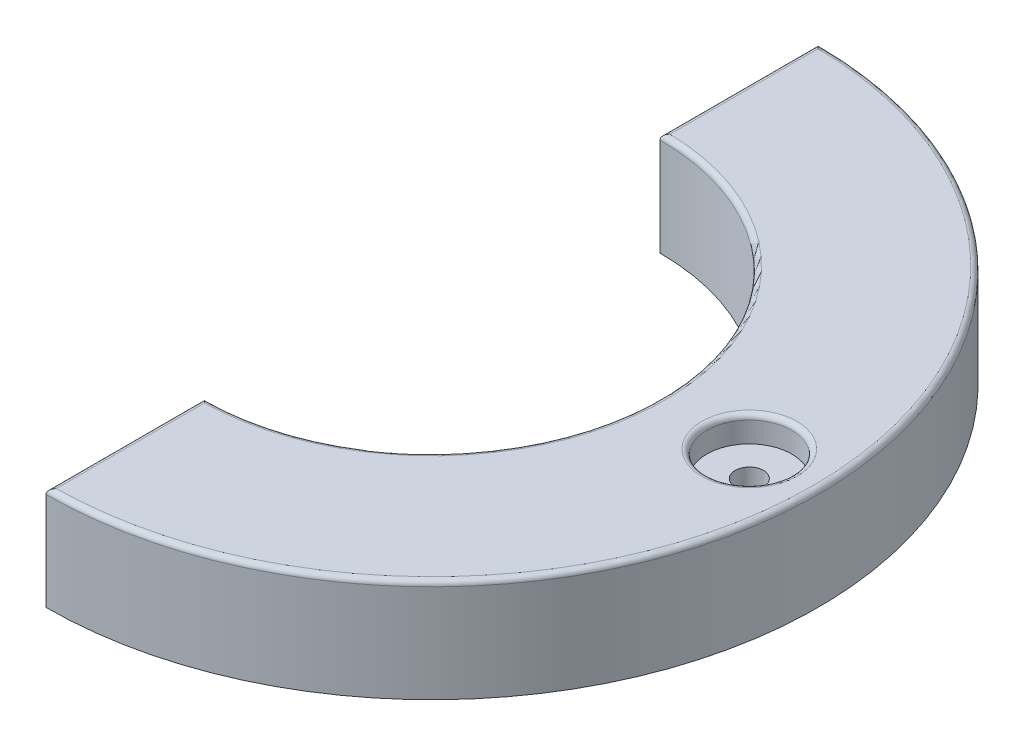
ISO-10303-21;
HEADER;
FILE_DESCRIPTION(('STEP AP214'),'2;1');
FILE_NAME('part.step','',(''),(''),'','','');
FILE_SCHEMA(('AUTOMOTIVE_DESIGN { 1 0 10303 214 1 1 1 1 }'));
ENDSEC;
DATA;
#1=APPLICATION_CONTEXT('core data for automotive mechanical design processes');
#2=APPLICATION_PROTOCOL_DEFINITION('international standard','automotive_design',2000,#1);
#3=PRODUCT_CONTEXT('',#1,'mechanical');
#4=PRODUCT('Part','Part','',(#3));
#5=PRODUCT_RELATED_PRODUCT_CATEGORY('part','',(#4));
#6=PRODUCT_DEFINITION_FORMATION('','',#4);
#7=PRODUCT_DEFINITION_CONTEXT('part definition',#1,'design');
#8=PRODUCT_DEFINITION('design','',#6,#7);
#9=PRODUCT_DEFINITION_SHAPE('','',#8);
#10=(LENGTH_UNIT() NAMED_UNIT(*) SI_UNIT(.MILLI.,.METRE.));
#11=(NAMED_UNIT(*) PLANE_ANGLE_UNIT() SI_UNIT($,.RADIAN.));
#12=(NAMED_UNIT(*) SI_UNIT($,.STERADIAN.) SOLID_ANGLE_UNIT());
#13=UNCERTAINTY_MEASURE_WITH_UNIT(LENGTH_MEASURE(1.E-05),#10,'distance_accuracy_value','');
#14=(GEOMETRIC_REPRESENTATION_CONTEXT(3) GLOBAL_UNCERTAINTY_ASSIGNED_CONTEXT((#13)) GLOBAL_UNIT_ASSIGNED_CONTEXT((#10,
#11,#12)) REPRESENTATION_CONTEXT('',''));
#15=CARTESIAN_POINT('',(0.,0.,0.));
#16=DIRECTION('',(0.,0.,1.));
#17=DIRECTION('',(1.,0.,0.));
#18=AXIS2_PLACEMENT_3D('',#15,#16,#17);
#19=CARTESIAN_POINT('',(61.63,-5.,0.));
#20=DIRECTION('',(0.,1.,0.));
#21=DIRECTION('',(0.,0.,1.));
#22=AXIS2_PLACEMENT_3D('',#19,#20,#21);
#23=CYLINDRICAL_SURFACE('',#22,2.75000000000001);
#24=CARTESIAN_POINT('',(61.63,15.,0.));
#25=DIRECTION('',(0.,1.,0.));
#26=DIRECTION('',(0.,0.,1.));
#27=AXIS2_PLACEMENT_3D('',#24,#25,#26);
#28=CIRCLE('',#27,2.75000000000001);
#29=CARTESIAN_POINT('',(61.63,15.,2.75000000000001));
#30=VERTEX_POINT('',#29);
#31=EDGE_CURVE('E182',#30,#30,#28,.T.);
#32=ORIENTED_EDGE('',*,*,#31,.T.);
#33=EDGE_LOOP('',(#32));
#34=FACE_BOUND('',#33,.T.);
#35=CARTESIAN_POINT('',(61.63,4.,0.));
#36=DIRECTION('',(0.,-1.,0.));
#37=DIRECTION('',(0.,0.,-1.));
#38=AXIS2_PLACEMENT_3D('',#35,#36,#37);
#39=CIRCLE('',#38,2.75000000000001);
#40=CARTESIAN_POINT('',(61.63,4.,-2.75000000000001));
#41=VERTEX_POINT('',#40);
#42=EDGE_CURVE('E38',#41,#41,#39,.F.);
#43=ORIENTED_EDGE('',*,*,#42,.F.);
#44=EDGE_LOOP('',(#43));
#45=FACE_BOUND('',#44,.T.);
#46=ADVANCED_FACE('F33',(#34,#45),#23,.F.);
#47=CARTESIAN_POINT('',(0.,20.,0.));
#48=DIRECTION('',(0.,-1.,0.));
#49=DIRECTION('',(0.,0.,-1.));
#50=AXIS2_PLACEMENT_3D('',#47,#48,#49);
#51=CYLINDRICAL_SURFACE('',#50,75.);
#52=DIRECTION('',(0.,-1.,0.));
#53=VECTOR('',#52,1.);
#54=CARTESIAN_POINT('',(0.,20.,-75.));
#55=LINE('',#54,#53);
#56=CARTESIAN_POINT('',(0.,19.,-75.));
#57=VERTEX_POINT('',#56);
#58=CARTESIAN_POINT('',(0.,0.,-75.));
#59=VERTEX_POINT('',#58);
#60=EDGE_CURVE('E86',#57,#59,#55,.T.);
#61=ORIENTED_EDGE('',*,*,#60,.F.);
#62=CARTESIAN_POINT('',(0.,19.,0.));
#63=DIRECTION('',(0.,-1.,0.));
#64=DIRECTION('',(0.,0.,-1.));
#65=AXIS2_PLACEMENT_3D('',#62,#63,#64);
#66=CIRCLE('',#65,75.);
#67=CARTESIAN_POINT('',(0.,19.,75.));
#68=VERTEX_POINT('',#67);
#69=EDGE_CURVE('E11',#57,#68,#66,.T.);
#70=ORIENTED_EDGE('',*,*,#69,.T.);
#71=DIRECTION('',(0.,-1.,0.));
#72=VECTOR('',#71,1.);
#73=CARTESIAN_POINT('',(0.,20.,75.));
#74=LINE('',#73,#72);
#75=CARTESIAN_POINT('',(0.,0.,75.));
#76=VERTEX_POINT('',#75);
#77=EDGE_CURVE('E104',#68,#76,#74,.T.);
#78=ORIENTED_EDGE('',*,*,#77,.T.);
#79=CARTESIAN_POINT('',(0.,0.,0.));
#80=DIRECTION('',(0.,1.,0.));
#81=DIRECTION('',(0.,0.,-1.));
#82=AXIS2_PLACEMENT_3D('',#79,#80,#81);
#83=CIRCLE('',#82,75.);
#84=EDGE_CURVE('E99',#76,#59,#83,.T.);
#85=ORIENTED_EDGE('',*,*,#84,.T.);
#86=EDGE_LOOP('',(#61,#70,#78,#85));
#87=FACE_BOUND('',#86,.T.);
#88=ADVANCED_FACE('F103',(#87),#51,.T.);
#89=CARTESIAN_POINT('',(0.,20.,-44.25));
#90=DIRECTION('',(1.,0.,0.));
#91=DIRECTION('',(0.,0.,-1.));
#92=AXIS2_PLACEMENT_3D('',#89,#90,#91);
#93=PLANE('',#92);
#94=CARTESIAN_POINT('',(0.,10.,-63.));
#95=DIRECTION('',(-1.,0.,0.));
#96=DIRECTION('',(0.,0.,1.));
#97=AXIS2_PLACEMENT_3D('',#94,#95,#96);
#98=CIRCLE('',#97,2.1);
#99=CARTESIAN_POINT('',(0.,10.,-60.9));
#100=VERTEX_POINT('',#99);
#101=EDGE_CURVE('E109',#100,#100,#98,.T.);
#102=ORIENTED_EDGE('',*,*,#101,.F.);
#103=EDGE_LOOP('',(#102));
#104=FACE_BOUND('',#103,.T.);
#105=DIRECTION('',(0.,-1.,0.));
#106=VECTOR('',#105,1.);
#107=CARTESIAN_POINT('',(0.,20.,-44.25));
#108=LINE('',#107,#106);
#109=CARTESIAN_POINT('',(0.,19.,-44.25));
#110=VERTEX_POINT('',#109);
#111=CARTESIAN_POINT('',(0.,0.,-44.25));
#112=VERTEX_POINT('',#111);
#113=EDGE_CURVE('E93',#110,#112,#108,.T.);
#114=ORIENTED_EDGE('',*,*,#113,.F.);
#115=DIRECTION('',(0.,0.,1.));
#116=VECTOR('',#115,1.);
#117=CARTESIAN_POINT('',(0.,19.,-44.25));
#118=LINE('',#117,#116);
#119=EDGE_CURVE('E57',#110,#57,#118,.F.);
#120=ORIENTED_EDGE('',*,*,#119,.T.);
#121=ORIENTED_EDGE('',*,*,#60,.T.);
#122=DIRECTION('',(0.,0.,1.));
#123=VECTOR('',#122,1.);
#124=CARTESIAN_POINT('',(0.,0.,-44.25));
#125=LINE('',#124,#123);
#126=EDGE_CURVE('E89',#59,#112,#125,.T.);
#127=ORIENTED_EDGE('',*,*,#126,.T.);
#128=EDGE_LOOP('',(#114,#120,#121,#127));
#129=FACE_BOUND('',#128,.T.);
#130=ADVANCED_FACE('F88',(#104,#129),#93,.F.);
#131=CARTESIAN_POINT('',(0.,20.,0.));
#132=DIRECTION('',(0.,-1.,0.));
#133=DIRECTION('',(0.,0.,-1.));
#134=AXIS2_PLACEMENT_3D('',#131,#132,#133);
#135=CYLINDRICAL_SURFACE('',#134,44.25);
#136=DIRECTION('',(0.,-1.,0.));
#137=VECTOR('',#136,1.);
#138=CARTESIAN_POINT('',(0.,20.,44.25));
#139=LINE('',#138,#137);
#140=CARTESIAN_POINT('',(0.,19.,44.25));
#141=VERTEX_POINT('',#140);
#142=CARTESIAN_POINT('',(0.,0.,44.25));
#143=VERTEX_POINT('',#142);
#144=EDGE_CURVE('E117',#141,#143,#139,.T.);
#145=ORIENTED_EDGE('',*,*,#144,.F.);
#146=CARTESIAN_POINT('',(0.,19.,0.));
#147=DIRECTION('',(0.,-1.,0.));
#148=DIRECTION('',(0.,0.,-1.));
#149=AXIS2_PLACEMENT_3D('',#146,#147,#148);
#150=CIRCLE('',#149,44.25);
#151=EDGE_CURVE('E128',#141,#110,#150,.F.);
#152=ORIENTED_EDGE('',*,*,#151,.T.);
#153=ORIENTED_EDGE('',*,*,#113,.T.);
#154=CARTESIAN_POINT('',(0.,0.,0.));
#155=DIRECTION('',(0.,-1.,0.));
#156=DIRECTION('',(0.,0.,-1.));
#157=AXIS2_PLACEMENT_3D('',#154,#155,#156);
#158=CIRCLE('',#157,44.25);
#159=EDGE_CURVE('E101',#112,#143,#158,.T.);
#160=ORIENTED_EDGE('',*,*,#159,.T.);
#161=EDGE_LOOP('',(#145,#152,#153,#160));
#162=FACE_BOUND('',#161,.T.);
#163=ADVANCED_FACE('F208',(#162),#135,.F.);
#164=CARTESIAN_POINT('',(0.,20.,75.));
#165=DIRECTION('',(1.,0.,0.));
#166=DIRECTION('',(0.,0.,-1.));
#167=AXIS2_PLACEMENT_3D('',#164,#165,#166);
#168=PLANE('',#167);
#169=CARTESIAN_POINT('',(0.,10.,63.));
#170=DIRECTION('',(-1.,0.,0.));
#171=DIRECTION('',(0.,0.,1.));
#172=AXIS2_PLACEMENT_3D('',#169,#170,#171);
#173=CIRCLE('',#172,2.09999999999999);
#174=CARTESIAN_POINT('',(0.,10.,65.1));
#175=VERTEX_POINT('',#174);
#176=EDGE_CURVE('E179',#175,#175,#173,.T.);
#177=ORIENTED_EDGE('',*,*,#176,.F.);
#178=EDGE_LOOP('',(#177));
#179=FACE_BOUND('',#178,.T.);
#180=ORIENTED_EDGE('',*,*,#77,.F.);
#181=DIRECTION('',(0.,0.,1.));
#182=VECTOR('',#181,1.);
#183=CARTESIAN_POINT('',(0.,19.,75.));
#184=LINE('',#183,#182);
#185=EDGE_CURVE('E43',#68,#141,#184,.F.);
#186=ORIENTED_EDGE('',*,*,#185,.T.);
#187=ORIENTED_EDGE('',*,*,#144,.T.);
#188=DIRECTION('',(0.,0.,1.));
#189=VECTOR('',#188,1.);
#190=CARTESIAN_POINT('',(0.,0.,75.));
#191=LINE('',#190,#189);
#192=EDGE_CURVE('E114',#143,#76,#191,.T.);
#193=ORIENTED_EDGE('',*,*,#192,.T.);
#194=EDGE_LOOP('',(#180,#186,#187,#193));
#195=FACE_BOUND('',#194,.T.);
#196=ADVANCED_FACE('F204',(#179,#195),#168,.F.);
#197=CARTESIAN_POINT('',(0.,20.,0.));
#198=DIRECTION('',(0.,-1.,0.));
#199=DIRECTION('',(0.,0.,-1.));
#200=AXIS2_PLACEMENT_3D('',#197,#198,#199);
#201=PLANE('',#200);
#202=CARTESIAN_POINT('',(61.63,20.,0.));
#203=DIRECTION('',(0.,-1.,0.));
#204=DIRECTION('',(0.,0.,-1.));
#205=AXIS2_PLACEMENT_3D('',#202,#203,#204);
#206=CIRCLE('',#205,9.25);
#207=CARTESIAN_POINT('',(61.63,20.,-9.25));
#208=VERTEX_POINT('',#207);
#209=EDGE_CURVE('E122',#208,#208,#206,.T.);
#210=ORIENTED_EDGE('',*,*,#209,.T.);
#211=EDGE_LOOP('',(#210));
#212=FACE_BOUND('',#211,.T.);
#213=CARTESIAN_POINT('',(0.,20.,0.));
#214=DIRECTION('',(0.,-1.,0.));
#215=DIRECTION('',(0.,0.,-1.));
#216=AXIS2_PLACEMENT_3D('',#213,#214,#215);
#217=CIRCLE('',#216,74.);
#218=CARTESIAN_POINT('',(1.,20.,73.9932429347437));
#219=VERTEX_POINT('',#218);
#220=CARTESIAN_POINT('',(1.,20.,-73.9932429347437));
#221=VERTEX_POINT('',#220);
#222=EDGE_CURVE('E131',#219,#221,#217,.F.);
#223=ORIENTED_EDGE('',*,*,#222,.T.);
#224=DIRECTION('',(0.,0.,1.));
#225=VECTOR('',#224,1.);
#226=CARTESIAN_POINT('',(1.,20.,0.));
#227=LINE('',#226,#225);
#228=CARTESIAN_POINT('',(1.,20.,-45.2389489267821));
#229=VERTEX_POINT('',#228);
#230=EDGE_CURVE('E135',#221,#229,#227,.T.);
#231=ORIENTED_EDGE('',*,*,#230,.T.);
#232=CARTESIAN_POINT('',(0.,20.,0.));
#233=DIRECTION('',(0.,-1.,0.));
#234=DIRECTION('',(0.,0.,-1.));
#235=AXIS2_PLACEMENT_3D('',#232,#233,#234);
#236=CIRCLE('',#235,45.25);
#237=CARTESIAN_POINT('',(1.,20.,45.2389489267821));
#238=VERTEX_POINT('',#237);
#239=EDGE_CURVE('E125',#229,#238,#236,.T.);
#240=ORIENTED_EDGE('',*,*,#239,.T.);
#241=DIRECTION('',(0.,0.,1.));
#242=VECTOR('',#241,1.);
#243=CARTESIAN_POINT('',(1.00000000000001,20.,0.));
#244=LINE('',#243,#242);
#245=EDGE_CURVE('E133',#238,#219,#244,.T.);
#246=ORIENTED_EDGE('',*,*,#245,.T.);
#247=EDGE_LOOP('',(#223,#231,#240,#246));
#248=FACE_BOUND('',#247,.T.);
#249=ADVANCED_FACE('F207',(#212,#248),#201,.F.);
#250=CARTESIAN_POINT('',(0.,0.,0.));
#251=DIRECTION('',(0.,-1.,0.));
#252=DIRECTION('',(0.,0.,-1.));
#253=AXIS2_PLACEMENT_3D('',#250,#251,#252);
#254=PLANE('',#253);
#255=CARTESIAN_POINT('',(61.63,0.,0.));
#256=DIRECTION('',(0.,-1.,0.));
#257=DIRECTION('',(0.,0.,-1.));
#258=AXIS2_PLACEMENT_3D('',#255,#256,#257);
#259=CIRCLE('',#258,5.);
#260=CARTESIAN_POINT('',(61.63,0.,-5.));
#261=VERTEX_POINT('',#260);
#262=EDGE_CURVE('E193',#261,#261,#259,.T.);
#263=ORIENTED_EDGE('',*,*,#262,.F.);
#264=EDGE_LOOP('',(#263));
#265=FACE_BOUND('',#264,.T.);
#266=ORIENTED_EDGE('',*,*,#84,.F.);
#267=ORIENTED_EDGE('',*,*,#192,.F.);
#268=ORIENTED_EDGE('',*,*,#159,.F.);
#269=ORIENTED_EDGE('',*,*,#126,.F.);
#270=EDGE_LOOP('',(#266,#267,#268,#269));
#271=FACE_BOUND('',#270,.T.);
#272=ADVANCED_FACE('F97',(#265,#271),#254,.T.);
#273=CARTESIAN_POINT('',(30.,10.,-63.));
#274=DIRECTION('',(-1.,0.,0.));
#275=DIRECTION('',(0.,0.,1.));
#276=AXIS2_PLACEMENT_3D('',#273,#274,#275);
#277=CYLINDRICAL_SURFACE('',#276,2.1);
#278=CARTESIAN_POINT('',(30.,10.,-63.));
#279=DIRECTION('',(-1.,0.,0.));
#280=DIRECTION('',(0.,0.,1.));
#281=AXIS2_PLACEMENT_3D('',#278,#279,#280);
#282=CIRCLE('',#281,2.1);
#283=CARTESIAN_POINT('',(30.,10.,-60.9));
#284=VERTEX_POINT('',#283);
#285=EDGE_CURVE('E106',#284,#284,#282,.T.);
#286=ORIENTED_EDGE('',*,*,#285,.F.);
#287=EDGE_LOOP('',(#286));
#288=FACE_BOUND('',#287,.T.);
#289=ORIENTED_EDGE('',*,*,#101,.T.);
#290=EDGE_LOOP('',(#289));
#291=FACE_BOUND('',#290,.T.);
#292=ADVANCED_FACE('F253',(#288,#291),#277,.F.);
#293=CARTESIAN_POINT('',(30.,10.,-63.));
#294=DIRECTION('',(-1.,0.,0.));
#295=DIRECTION('',(0.,0.,1.));
#296=AXIS2_PLACEMENT_3D('',#293,#294,#295);
#297=PLANE('',#296);
#298=ORIENTED_EDGE('',*,*,#285,.T.);
#299=EDGE_LOOP('',(#298));
#300=FACE_BOUND('',#299,.T.);
#301=ADVANCED_FACE('F249',(#300),#297,.T.);
#302=CARTESIAN_POINT('',(30.,10.,63.));
#303=DIRECTION('',(-1.,0.,0.));
#304=DIRECTION('',(0.,0.,1.));
#305=AXIS2_PLACEMENT_3D('',#302,#303,#304);
#306=CYLINDRICAL_SURFACE('',#305,2.09999999999999);
#307=CARTESIAN_POINT('',(30.,10.,63.));
#308=DIRECTION('',(-1.,0.,0.));
#309=DIRECTION('',(0.,0.,1.));
#310=AXIS2_PLACEMENT_3D('',#307,#308,#309);
#311=CIRCLE('',#310,2.09999999999999);
#312=CARTESIAN_POINT('',(30.,10.,65.1));
#313=VERTEX_POINT('',#312);
#314=EDGE_CURVE('E196',#313,#313,#311,.T.);
#315=ORIENTED_EDGE('',*,*,#314,.F.);
#316=EDGE_LOOP('',(#315));
#317=FACE_BOUND('',#316,.T.);
#318=ORIENTED_EDGE('',*,*,#176,.T.);
#319=EDGE_LOOP('',(#318));
#320=FACE_BOUND('',#319,.T.);
#321=ADVANCED_FACE('F202',(#317,#320),#306,.F.);
#322=CARTESIAN_POINT('',(30.,10.,63.));
#323=DIRECTION('',(-1.,0.,0.));
#324=DIRECTION('',(0.,0.,1.));
#325=AXIS2_PLACEMENT_3D('',#322,#323,#324);
#326=PLANE('',#325);
#327=ORIENTED_EDGE('',*,*,#314,.T.);
#328=EDGE_LOOP('',(#327));
#329=FACE_BOUND('',#328,.T.);
#330=ADVANCED_FACE('F242',(#329),#326,.T.);
#331=CARTESIAN_POINT('',(61.63,15.,0.));
#332=DIRECTION('',(0.,1.,0.));
#333=DIRECTION('',(0.,0.,1.));
#334=AXIS2_PLACEMENT_3D('',#331,#332,#333);
#335=CYLINDRICAL_SURFACE('',#334,8.25);
#336=CARTESIAN_POINT('',(61.63,19.,0.));
#337=DIRECTION('',(0.,-1.,0.));
#338=DIRECTION('',(0.,0.,-1.));
#339=AXIS2_PLACEMENT_3D('',#336,#337,#338);
#340=CIRCLE('',#339,8.25);
#341=CARTESIAN_POINT('',(61.63,19.,-8.25));
#342=VERTEX_POINT('',#341);
#343=EDGE_CURVE('E92',#342,#342,#340,.F.);
#344=ORIENTED_EDGE('',*,*,#343,.T.);
#345=EDGE_LOOP('',(#344));
#346=FACE_BOUND('',#345,.T.);
#347=CARTESIAN_POINT('',(61.63,15.,0.));
#348=DIRECTION('',(0.,1.,0.));
#349=DIRECTION('',(0.,0.,1.));
#350=AXIS2_PLACEMENT_3D('',#347,#348,#349);
#351=CIRCLE('',#350,8.25);
#352=CARTESIAN_POINT('',(61.63,15.,8.25));
#353=VERTEX_POINT('',#352);
#354=EDGE_CURVE('E175',#353,#353,#351,.T.);
#355=ORIENTED_EDGE('',*,*,#354,.F.);
#356=EDGE_LOOP('',(#355));
#357=FACE_BOUND('',#356,.T.);
#358=ADVANCED_FACE('F238',(#346,#357),#335,.F.);
#359=CARTESIAN_POINT('',(61.63,15.,0.));
#360=DIRECTION('',(0.,1.,0.));
#361=DIRECTION('',(0.,0.,1.));
#362=AXIS2_PLACEMENT_3D('',#359,#360,#361);
#363=PLANE('',#362);
#364=ORIENTED_EDGE('',*,*,#31,.F.);
#365=EDGE_LOOP('',(#364));
#366=FACE_BOUND('',#365,.T.);
#367=ORIENTED_EDGE('',*,*,#354,.T.);
#368=EDGE_LOOP('',(#367));
#369=FACE_BOUND('',#368,.T.);
#370=ADVANCED_FACE('F235',(#366,#369),#363,.T.);
#371=CARTESIAN_POINT('',(61.63,19.,0.));
#372=DIRECTION('',(0.,-1.,0.));
#373=DIRECTION('',(0.,0.,-1.));
#374=AXIS2_PLACEMENT_3D('',#371,#372,#373);
#375=TOROIDAL_SURFACE('',#374,9.25,1.);
#376=ORIENTED_EDGE('',*,*,#209,.F.);
#377=EDGE_LOOP('',(#376));
#378=FACE_BOUND('',#377,.T.);
#379=ORIENTED_EDGE('',*,*,#343,.F.);
#380=EDGE_LOOP('',(#379));
#381=FACE_BOUND('',#380,.T.);
#382=ADVANCED_FACE('F154',(#378,#381),#375,.T.);
#383=CARTESIAN_POINT('',(0.,19.,0.));
#384=DIRECTION('',(0.,-1.,0.));
#385=DIRECTION('',(0.,0.,-1.));
#386=AXIS2_PLACEMENT_3D('',#383,#384,#385);
#387=TOROIDAL_SURFACE('',#386,45.25,1.);
#388=ORIENTED_EDGE('',*,*,#239,.F.);
#389=CARTESIAN_POINT('',(0.,19.,-44.25));
#390=CARTESIAN_POINT('',(-3.04450319687807E-06,19.0224542306805,-44.2499968904094));
#391=CARTESIAN_POINT('',(0.000756951248705987,19.0448945503358,-44.250756956354));
#392=CARTESIAN_POINT('',(0.00376746637983453,19.0895569347193,-44.2537673456424));
#393=CARTESIAN_POINT('',(0.00601680563025854,19.1117791581262,-44.2560164890681));
#394=CARTESIAN_POINT('',(0.0148911003422725,19.177469951027,-44.2648890054622));
#395=CARTESIAN_POINT('',(0.0236438560164837,19.2203936561093,-44.2736390066984));
#396=CARTESIAN_POINT('',(0.0461454870151439,19.3033303141234,-44.2961228408629));
#397=CARTESIAN_POINT('',(0.0598804083838781,19.3433510256777,-44.3098427540104));
#398=CARTESIAN_POINT('',(0.0915345970484941,19.4200188320202,-44.3414429446058));
#399=CARTESIAN_POINT('',(0.109463382992545,19.4566579839974,-44.3593326858132));
#400=CARTESIAN_POINT('',(0.15672928262676,19.5404280750712,-44.406461189904));
#401=CARTESIAN_POINT('',(0.187728645866884,19.5856936855307,-44.4373444392295));
#402=CARTESIAN_POINT('',(0.254492949932881,19.6686294317084,-44.5037777849919));
#403=CARTESIAN_POINT('',(0.290266950424559,19.7062847770609,-44.5393367514518));
#404=CARTESIAN_POINT('',(0.379448769484225,19.7872733516534,-44.6278650378937));
#405=CARTESIAN_POINT('',(0.434383402143322,19.8273069218823,-44.6823072547034));
#406=CARTESIAN_POINT('',(0.548155080264591,19.8945444291353,-44.7948368184937));
#407=CARTESIAN_POINT('',(0.60699645161236,19.9217338643827,-44.8529282021878));
#408=CARTESIAN_POINT('',(0.720552617317914,19.9618413517254,-44.964810707738));
#409=CARTESIAN_POINT('',(0.775045012592181,19.9759653170214,-45.0184062151044));
#410=CARTESIAN_POINT('',(0.884850811228396,19.9949048394279,-45.1262084928442));
#411=CARTESIAN_POINT('',(0.94016226016939,19.9997397937011,-45.1804137511804));
#412=CARTESIAN_POINT('',(0.996985515790747,19.9999965884479,-45.2360002692583));
#413=CARTESIAN_POINT('',(0.998492760868123,19.9999999958635,-45.2374746371988));
#414=CARTESIAN_POINT('',(1.,20.,-45.2389489267821));
#415=B_SPLINE_CURVE_WITH_KNOTS('',3,(#389,#390,#391,#392,#393,#394,#395,#396,#397,#398,#399,
#400,#401,#402,#403,#404,#405,#406,#407,#408,#409,#410,#411,#412,#413,#414),.UNSPECIFIED.,.F.,
.F.,(4,2,2,2,2,2,2,2,2,2,2,2,4),(0.,0.0673106933728452,0.134568114698209,0.267810267485539,
0.40068208372775,0.533858451215099,0.721691033225963,0.909885225337864,1.16975560241229,
1.42991869112571,1.66254584563411,1.89468670163427,1.90101203765906),.UNSPECIFIED.);
#416=EDGE_CURVE('E144',#229,#110,#415,.F.);
#417=ORIENTED_EDGE('',*,*,#416,.T.);
#418=ORIENTED_EDGE('',*,*,#151,.F.);
#419=CARTESIAN_POINT('',(0.,19.,44.25));
#420=CARTESIAN_POINT('',(-3.04450319354817E-06,19.0224542306805,44.2499968904095));
#421=CARTESIAN_POINT('',(0.000756951248709368,19.0448945503358,44.2507569563541));
#422=CARTESIAN_POINT('',(0.00376746637983795,19.0895569347193,44.2537673456425));
#423=CARTESIAN_POINT('',(0.00601680563026195,19.1117791581262,44.2560164890681));
#424=CARTESIAN_POINT('',(0.0148911003422758,19.177469951027,44.2648890054623));
#425=CARTESIAN_POINT('',(0.023643856016487,19.2203936561093,44.2736390066984));
#426=CARTESIAN_POINT('',(0.046145487015147,19.3033303141234,44.296122840863));
#427=CARTESIAN_POINT('',(0.0598804083838812,19.3433510256777,44.3098427540104));
#428=CARTESIAN_POINT('',(0.0915345970484972,19.4200188320202,44.3414429446058));
#429=CARTESIAN_POINT('',(0.109463382992548,19.4566579839974,44.3593326858133));
#430=CARTESIAN_POINT('',(0.156729282626762,19.5404280750712,44.406461189904));
#431=CARTESIAN_POINT('',(0.187728645866884,19.5856936855307,44.4373444392295));
#432=CARTESIAN_POINT('',(0.254492949932881,19.6686294317084,44.503777784992));
#433=CARTESIAN_POINT('',(0.290266950424561,19.7062847770609,44.5393367514519));
#434=CARTESIAN_POINT('',(0.379448769484228,19.7872733516534,44.6278650378938));
#435=CARTESIAN_POINT('',(0.434383402143325,19.8273069218823,44.6823072547034));
#436=CARTESIAN_POINT('',(0.548155080264594,19.8945444291353,44.7948368184937));
#437=CARTESIAN_POINT('',(0.606996451612364,19.9217338643827,44.8529282021878));
#438=CARTESIAN_POINT('',(0.720552617317917,19.9618413517254,44.964810707738));
#439=CARTESIAN_POINT('',(0.775045012592182,19.9759653170214,45.0184062151044));
#440=CARTESIAN_POINT('',(0.884850811228396,19.9949048394279,45.1262084928442));
#441=CARTESIAN_POINT('',(0.940162260169391,19.9997397937011,45.1804137511804));
#442=CARTESIAN_POINT('',(0.99698551579075,19.9999965884479,45.2360002692583));
#443=CARTESIAN_POINT('',(0.998492760868125,19.9999999958635,45.2374746371989));
#444=CARTESIAN_POINT('',(1.,20.,45.2389489267821));
#445=B_SPLINE_CURVE_WITH_KNOTS('',3,(#419,#420,#421,#422,#423,#424,#425,#426,#427,#428,#429,
#430,#431,#432,#433,#434,#435,#436,#437,#438,#439,#440,#441,#442,#443,#444),.UNSPECIFIED.,.F.,
.F.,(4,2,2,2,2,2,2,2,2,2,2,2,4),(0.,0.0673106933728452,0.134568114698209,0.267810267485539,
0.40068208372775,0.533858451215099,0.721691033225956,0.909885225337864,1.16975560241229,
1.42991869112571,1.66254584563412,1.89468670163427,1.90101203765906),.UNSPECIFIED.);
#446=EDGE_CURVE('E138',#141,#238,#445,.T.);
#447=ORIENTED_EDGE('',*,*,#446,.T.);
#448=EDGE_LOOP('',(#388,#417,#418,#447));
#449=FACE_BOUND('',#448,.T.);
#450=ADVANCED_FACE('F149',(#449),#387,.T.);
#451=CARTESIAN_POINT('',(1.00000000000001,19.,0.));
#452=DIRECTION('',(0.,0.,1.));
#453=DIRECTION('',(1.,0.,0.));
#454=AXIS2_PLACEMENT_3D('',#451,#452,#453);
#455=CYLINDRICAL_SURFACE('',#454,1.);
#456=ORIENTED_EDGE('',*,*,#446,.F.);
#457=ORIENTED_EDGE('',*,*,#185,.F.);
#458=CARTESIAN_POINT('',(0.,19.,75.));
#459=CARTESIAN_POINT('',(-3.01803110661016E-06,19.0224194101774,75.0000029798952));
#460=CARTESIAN_POINT('',(0.000754608982115893,19.0448249889844,74.9992453940383));
#461=CARTESIAN_POINT('',(0.00375584771926266,19.0894191326682,74.9962440814525));
#462=CARTESIAN_POINT('',(0.0059983052539837,19.1116078525304,74.994001509034));
#463=CARTESIAN_POINT('',(0.0148462440370313,19.1772052294318,74.9851525271705));
#464=CARTESIAN_POINT('',(0.0235737880396319,19.2200711972579,74.9764233675157));
#465=CARTESIAN_POINT('',(0.0460116850550331,19.3029008212662,74.9539750114925));
#466=CARTESIAN_POINT('',(0.0597084349104749,19.342872046821,74.9402694379317));
#467=CARTESIAN_POINT('',(0.0912694122228099,19.4194383228063,74.9086766575196));
#468=CARTESIAN_POINT('',(0.109142966318968,19.4560255578977,74.8907800921575));
#469=CARTESIAN_POINT('',(0.156168823610401,19.5395240350456,74.8436732664807));
#470=CARTESIAN_POINT('',(0.186952721022936,19.5845877161722,74.8128210101364));
#471=CARTESIAN_POINT('',(0.25318748121993,19.6671460612808,74.7463911413473));
#472=CARTESIAN_POINT('',(0.288647145913156,19.7046261035198,74.710804615713));
#473=CARTESIAN_POINT('',(0.377243217166866,19.7855194864343,74.6218210645557));
#474=CARTESIAN_POINT('',(0.431890565308423,19.8255704898651,74.5668802640078));
#475=CARTESIAN_POINT('',(0.544874151763461,19.8928559917488,74.4531539092404));
#476=CARTESIAN_POINT('',(0.603214872483054,19.920074564474,74.3943636801354));
#477=CARTESIAN_POINT('',(0.717032888196871,19.9608730400009,74.2795267472918));
#478=CARTESIAN_POINT('',(0.772354248645874,19.9753861725527,74.223648787664));
#479=CARTESIAN_POINT('',(0.883663458594786,19.9948108241418,74.1110898538842));
#480=CARTESIAN_POINT('',(0.9396497103632,19.9997419541816,74.0544107595154));
#481=CARTESIAN_POINT('',(0.997038666085579,19.9999967070304,73.9962445153732));
#482=CARTESIAN_POINT('',(0.998519364753836,19.9999999951898,73.9947437158923));
#483=CARTESIAN_POINT('',(1.,20.,73.9932429347437));
#484=B_SPLINE_CURVE_WITH_KNOTS('',3,(#458,#459,#460,#461,#462,#463,#464,#465,#466,#467,#468,
#469,#470,#471,#472,#473,#474,#475,#476,#477,#478,#479,#480,#481,#482,#483),.UNSPECIFIED.,.F.,
.F.,(4,2,2,2,2,2,2,2,2,2,2,2,4),(0.,0.0672064810159174,0.134360782288267,0.267411171072486,
0.40010005037127,0.53308809867448,0.720125602956573,0.90752036151992,1.16780258643535,
1.42840699057331,1.66770210874687,1.90650695565004,1.9128318074389),.UNSPECIFIED.);
#485=EDGE_CURVE('E170',#219,#68,#484,.F.);
#486=ORIENTED_EDGE('',*,*,#485,.F.);
#487=ORIENTED_EDGE('',*,*,#245,.F.);
#488=EDGE_LOOP('',(#456,#457,#486,#487));
#489=FACE_BOUND('',#488,.T.);
#490=ADVANCED_FACE('F35',(#489),#455,.T.);
#491=CARTESIAN_POINT('',(0.,19.,0.));
#492=DIRECTION('',(0.,-1.,0.));
#493=DIRECTION('',(0.,0.,-1.));
#494=AXIS2_PLACEMENT_3D('',#491,#492,#493);
#495=TOROIDAL_SURFACE('',#494,74.,1.);
#496=ORIENTED_EDGE('',*,*,#485,.T.);
#497=ORIENTED_EDGE('',*,*,#69,.F.);
#498=CARTESIAN_POINT('',(0.,19.,-75.));
#499=CARTESIAN_POINT('',(-3.01803110661016E-06,19.0224194101774,-75.0000029798951));
#500=CARTESIAN_POINT('',(0.000754608982115893,19.0448249889844,-74.9992453940383));
#501=CARTESIAN_POINT('',(0.00375584771926266,19.0894191326682,-74.9962440814525));
#502=CARTESIAN_POINT('',(0.0059983052539837,19.1116078525304,-74.994001509034));
#503=CARTESIAN_POINT('',(0.0148462440370313,19.1772052294318,-74.9851525271704));
#504=CARTESIAN_POINT('',(0.0235737880396319,19.2200711972579,-74.9764233675157));
#505=CARTESIAN_POINT('',(0.0460116850550331,19.3029008212662,-74.9539750114925));
#506=CARTESIAN_POINT('',(0.0597084349104749,19.342872046821,-74.9402694379317));
#507=CARTESIAN_POINT('',(0.0912694122228099,19.4194383228063,-74.9086766575196));
#508=CARTESIAN_POINT('',(0.109142966318968,19.4560255578977,-74.8907800921575));
#509=CARTESIAN_POINT('',(0.156168823610401,19.5395240350456,-74.8436732664807));
#510=CARTESIAN_POINT('',(0.186952721022936,19.5845877161722,-74.8128210101364));
#511=CARTESIAN_POINT('',(0.25318748121993,19.6671460612808,-74.7463911413473));
#512=CARTESIAN_POINT('',(0.288647145913156,19.7046261035198,-74.7108046157129));
#513=CARTESIAN_POINT('',(0.377243217166866,19.7855194864343,-74.6218210645557));
#514=CARTESIAN_POINT('',(0.431890565308423,19.8255704898651,-74.5668802640078));
#515=CARTESIAN_POINT('',(0.544874151763461,19.8928559917488,-74.4531539092404));
#516=CARTESIAN_POINT('',(0.603214872483054,19.920074564474,-74.3943636801354));
#517=CARTESIAN_POINT('',(0.71703288819687,19.9608730400009,-74.2795267472918));
#518=CARTESIAN_POINT('',(0.772354248645874,19.9753861725527,-74.223648787664));
#519=CARTESIAN_POINT('',(0.883663458594785,19.9948108241418,-74.1110898538841));
#520=CARTESIAN_POINT('',(0.9396497103632,19.9997419541816,-74.0544107595154));
#521=CARTESIAN_POINT('',(0.997038666085579,19.9999967070304,-73.9962445153732));
#522=CARTESIAN_POINT('',(0.998519364753836,19.9999999951898,-73.9947437158923));
#523=CARTESIAN_POINT('',(1.,20.,-73.9932429347437));
#524=B_SPLINE_CURVE_WITH_KNOTS('',3,(#498,#499,#500,#501,#502,#503,#504,#505,#506,#507,#508,
#509,#510,#511,#512,#513,#514,#515,#516,#517,#518,#519,#520,#521,#522,#523),.UNSPECIFIED.,.F.,
.F.,(4,2,2,2,2,2,2,2,2,2,2,2,4),(0.,0.0672064810159174,0.134360782288267,0.267411171072486,
0.40010005037127,0.53308809867448,0.720125602956573,0.90752036151992,1.16780258643535,
1.42840699057331,1.66770210874687,1.90650695565004,1.9128318074389),.UNSPECIFIED.);
#525=EDGE_CURVE('E166',#221,#57,#524,.F.);
#526=ORIENTED_EDGE('',*,*,#525,.F.);
#527=ORIENTED_EDGE('',*,*,#222,.F.);
#528=EDGE_LOOP('',(#496,#497,#526,#527));
#529=FACE_BOUND('',#528,.T.);
#530=ADVANCED_FACE('F157',(#529),#495,.T.);
#531=CARTESIAN_POINT('',(1.,19.,0.));
#532=DIRECTION('',(0.,0.,1.));
#533=DIRECTION('',(1.,0.,0.));
#534=AXIS2_PLACEMENT_3D('',#531,#532,#533);
#535=CYLINDRICAL_SURFACE('',#534,1.);
#536=ORIENTED_EDGE('',*,*,#525,.T.);
#537=ORIENTED_EDGE('',*,*,#119,.F.);
#538=ORIENTED_EDGE('',*,*,#416,.F.);
#539=ORIENTED_EDGE('',*,*,#230,.F.);
#540=EDGE_LOOP('',(#536,#537,#538,#539));
#541=FACE_BOUND('',#540,.T.);
#542=ADVANCED_FACE('F161',(#541),#535,.T.);
#543=CARTESIAN_POINT('',(61.63,4.,0.));
#544=DIRECTION('',(0.,-1.,0.));
#545=DIRECTION('',(0.,0.,-1.));
#546=AXIS2_PLACEMENT_3D('',#543,#544,#545);
#547=PLANE('',#546);
#548=CARTESIAN_POINT('',(61.63,4.,0.));
#549=DIRECTION('',(0.,-1.,0.));
#550=DIRECTION('',(0.,0.,-1.));
#551=AXIS2_PLACEMENT_3D('',#548,#549,#550);
#552=CIRCLE('',#551,5.);
#553=CARTESIAN_POINT('',(61.63,4.,-5.));
#554=VERTEX_POINT('',#553);
#555=EDGE_CURVE('E191',#554,#554,#552,.T.);
#556=ORIENTED_EDGE('',*,*,#555,.T.);
#557=EDGE_LOOP('',(#556));
#558=FACE_BOUND('',#557,.T.);
#559=ORIENTED_EDGE('',*,*,#42,.T.);
#560=EDGE_LOOP('',(#559));
#561=FACE_BOUND('',#560,.T.);
#562=ADVANCED_FACE('F220',(#558,#561),#547,.T.);
#563=CARTESIAN_POINT('',(61.63,4.,0.));
#564=DIRECTION('',(0.,-1.,0.));
#565=DIRECTION('',(0.,0.,-1.));
#566=AXIS2_PLACEMENT_3D('',#563,#564,#565);
#567=CYLINDRICAL_SURFACE('',#566,5.);
#568=ORIENTED_EDGE('',*,*,#555,.F.);
#569=EDGE_LOOP('',(#568));
#570=FACE_BOUND('',#569,.T.);
#571=ORIENTED_EDGE('',*,*,#262,.T.);
#572=EDGE_LOOP('',(#571));
#573=FACE_BOUND('',#572,.T.);
#574=ADVANCED_FACE('F224',(#570,#573),#567,.F.);
#575=CLOSED_SHELL('',(#46,#88,#130,#163,#196,#249,#272,#292,#301,#321,#330,#358,#370,#382,#450,
#490,#530,#542,#562,#574));
#576=MANIFOLD_SOLID_BREP('B2',#575);
#577=ADVANCED_BREP_SHAPE_REPRESENTATION('',(#18,#576),#14);
#578=SHAPE_DEFINITION_REPRESENTATION(#9,#577);
ENDSEC;
END-ISO-10303-21;
